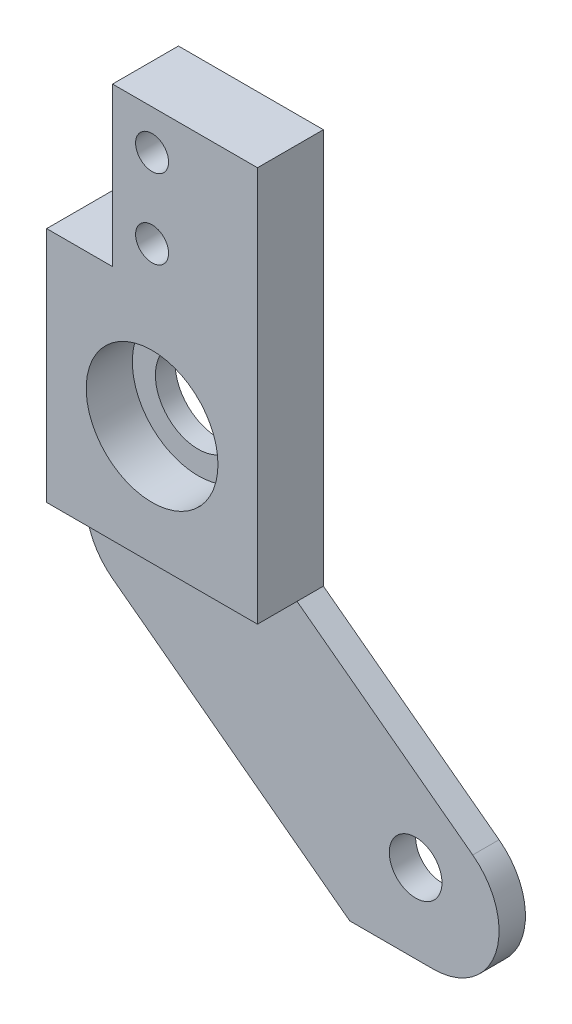
ISO-10303-21;
HEADER;
FILE_DESCRIPTION(('STEP AP214'),'2;1');
FILE_NAME('part.step','',(''),(''),'','','');
FILE_SCHEMA(('AUTOMOTIVE_DESIGN { 1 0 10303 214 1 1 1 1 }'));
ENDSEC;
DATA;
#1=APPLICATION_CONTEXT('core data for automotive mechanical design processes');
#2=APPLICATION_PROTOCOL_DEFINITION('international standard','automotive_design',2000,#1);
#3=PRODUCT_CONTEXT('',#1,'mechanical');
#4=PRODUCT('Part','Part','',(#3));
#5=PRODUCT_RELATED_PRODUCT_CATEGORY('part','',(#4));
#6=PRODUCT_DEFINITION_FORMATION('','',#4);
#7=PRODUCT_DEFINITION_CONTEXT('part definition',#1,'design');
#8=PRODUCT_DEFINITION('design','',#6,#7);
#9=PRODUCT_DEFINITION_SHAPE('','',#8);
#10=(LENGTH_UNIT() NAMED_UNIT(*) SI_UNIT(.MILLI.,.METRE.));
#11=(NAMED_UNIT(*) PLANE_ANGLE_UNIT() SI_UNIT($,.RADIAN.));
#12=(NAMED_UNIT(*) SI_UNIT($,.STERADIAN.) SOLID_ANGLE_UNIT());
#13=UNCERTAINTY_MEASURE_WITH_UNIT(LENGTH_MEASURE(1.E-05),#10,'distance_accuracy_value','');
#14=(GEOMETRIC_REPRESENTATION_CONTEXT(3) GLOBAL_UNCERTAINTY_ASSIGNED_CONTEXT((#13)) GLOBAL_UNIT_ASSIGNED_CONTEXT((#10,
#11,#12)) REPRESENTATION_CONTEXT('',''));
#15=CARTESIAN_POINT('',(0.,0.,0.));
#16=DIRECTION('',(0.,0.,1.));
#17=DIRECTION('',(1.,0.,0.));
#18=AXIS2_PLACEMENT_3D('',#15,#16,#17);
#19=CARTESIAN_POINT('',(4.49443926390629,-28.,5.));
#20=DIRECTION('',(0.,-1.,0.));
#21=DIRECTION('',(0.,0.,-1.));
#22=AXIS2_PLACEMENT_3D('',#19,#20,#21);
#23=PLANE('',#22);
#24=DIRECTION('',(1.,0.,0.));
#25=VECTOR('',#24,1.);
#26=CARTESIAN_POINT('',(12.,-28.,2.));
#27=LINE('',#26,#25);
#28=CARTESIAN_POINT('',(12.,-28.,2.));
#29=VERTEX_POINT('',#28);
#30=CARTESIAN_POINT('',(18.3333333333333,-28.,2.));
#31=VERTEX_POINT('',#30);
#32=EDGE_CURVE('E50',#29,#31,#27,.T.);
#33=ORIENTED_EDGE('',*,*,#32,.F.);
#34=DIRECTION('',(0.,0.,-1.));
#35=VECTOR('',#34,1.);
#36=CARTESIAN_POINT('',(12.,-28.,5.));
#37=LINE('',#36,#35);
#38=CARTESIAN_POINT('',(12.,-28.,0.));
#39=VERTEX_POINT('',#38);
#40=EDGE_CURVE('E139',#29,#39,#37,.T.);
#41=ORIENTED_EDGE('',*,*,#40,.T.);
#42=DIRECTION('',(-1.,0.,0.));
#43=VECTOR('',#42,1.);
#44=CARTESIAN_POINT('',(4.49443926390629,-28.,0.));
#45=LINE('',#44,#43);
#46=CARTESIAN_POINT('',(18.3333333333333,-28.,0.));
#47=VERTEX_POINT('',#46);
#48=EDGE_CURVE('E173',#47,#39,#45,.T.);
#49=ORIENTED_EDGE('',*,*,#48,.F.);
#50=DIRECTION('',(0.,0.,-1.));
#51=VECTOR('',#50,1.);
#52=CARTESIAN_POINT('',(18.3333333333333,-28.,5.));
#53=LINE('',#52,#51);
#54=EDGE_CURVE('E11',#47,#31,#53,.F.);
#55=ORIENTED_EDGE('',*,*,#54,.T.);
#56=EDGE_LOOP('',(#33,#41,#49,#55));
#57=FACE_BOUND('',#56,.T.);
#58=ADVANCED_FACE('F34',(#57),#23,.T.);
#59=CARTESIAN_POINT('',(33.4778201720869,-28.1083651290652,5.));
#60=DIRECTION('',(0.6,0.8,0.));
#61=DIRECTION('',(-0.8,0.6,0.));
#62=AXIS2_PLACEMENT_3D('',#59,#60,#61);
#63=PLANE('',#62);
#64=DIRECTION('',(-0.8,0.6,0.));
#65=VECTOR('',#64,1.);
#66=CARTESIAN_POINT('',(21.3333333333333,-19.,2.));
#67=LINE('',#66,#65);
#68=CARTESIAN_POINT('',(21.3333333333333,-19.,2.));
#69=VERTEX_POINT('',#68);
#70=CARTESIAN_POINT('',(8.00000000000001,-9.,2.));
#71=VERTEX_POINT('',#70);
#72=EDGE_CURVE('E165',#69,#71,#67,.T.);
#73=ORIENTED_EDGE('',*,*,#72,.F.);
#74=DIRECTION('',(0.,0.,-1.));
#75=VECTOR('',#74,1.);
#76=CARTESIAN_POINT('',(21.3333333333333,-19.,5.));
#77=LINE('',#76,#75);
#78=CARTESIAN_POINT('',(21.3333333333333,-19.,0.));
#79=VERTEX_POINT('',#78);
#80=EDGE_CURVE('E43',#69,#79,#77,.T.);
#81=ORIENTED_EDGE('',*,*,#80,.T.);
#82=DIRECTION('',(0.8,-0.6,0.));
#83=VECTOR('',#82,1.);
#84=CARTESIAN_POINT('',(33.4778201720869,-28.1083651290652,0.));
#85=LINE('',#84,#83);
#86=CARTESIAN_POINT('',(8.00000000000001,-9.00000000000001,0.));
#87=VERTEX_POINT('',#86);
#88=EDGE_CURVE('E162',#87,#79,#85,.T.);
#89=ORIENTED_EDGE('',*,*,#88,.F.);
#90=DIRECTION('',(0.,0.,-1.));
#91=VECTOR('',#90,1.);
#92=CARTESIAN_POINT('',(8.00000000000001,-9.00000000000001,5.));
#93=LINE('',#92,#91);
#94=EDGE_CURVE('E147',#71,#87,#93,.T.);
#95=ORIENTED_EDGE('',*,*,#94,.F.);
#96=EDGE_LOOP('',(#73,#81,#89,#95));
#97=FACE_BOUND('',#96,.T.);
#98=ADVANCED_FACE('F159',(#97),#63,.T.);
#99=CARTESIAN_POINT('',(8.00000000000001,-66.7528730066393,5.));
#100=DIRECTION('',(1.,0.,0.));
#101=DIRECTION('',(0.,1.,0.));
#102=AXIS2_PLACEMENT_3D('',#99,#100,#101);
#103=PLANE('',#102);
#104=DIRECTION('',(0.,-1.,0.));
#105=VECTOR('',#104,1.);
#106=CARTESIAN_POINT('',(8.00000000000001,-66.7528730066393,0.));
#107=LINE('',#106,#105);
#108=CARTESIAN_POINT('',(8.,21.,0.));
#109=VERTEX_POINT('',#108);
#110=EDGE_CURVE('E172',#109,#87,#107,.T.);
#111=ORIENTED_EDGE('',*,*,#110,.F.);
#112=DIRECTION('',(0.,0.,-1.));
#113=VECTOR('',#112,1.);
#114=CARTESIAN_POINT('',(8.,21.,5.));
#115=LINE('',#114,#113);
#116=CARTESIAN_POINT('',(8.,21.,5.));
#117=VERTEX_POINT('',#116);
#118=EDGE_CURVE('E187',#117,#109,#115,.T.);
#119=ORIENTED_EDGE('',*,*,#118,.F.);
#120=DIRECTION('',(0.,-1.,0.));
#121=VECTOR('',#120,1.);
#122=CARTESIAN_POINT('',(8.00000000000001,-66.7528730066393,5.));
#123=LINE('',#122,#121);
#124=CARTESIAN_POINT('',(8.00000000000001,-9.,5.));
#125=VERTEX_POINT('',#124);
#126=EDGE_CURVE('E186',#117,#125,#123,.T.);
#127=ORIENTED_EDGE('',*,*,#126,.T.);
#128=EDGE_CURVE('E143',#125,#71,#93,.T.);
#129=ORIENTED_EDGE('',*,*,#128,.T.);
#130=ORIENTED_EDGE('',*,*,#94,.T.);
#131=EDGE_LOOP('',(#111,#119,#127,#129,#130));
#132=FACE_BOUND('',#131,.T.);
#133=ADVANCED_FACE('F194',(#132),#103,.T.);
#134=CARTESIAN_POINT('',(4.49443926390629,21.,5.));
#135=DIRECTION('',(0.,1.,0.));
#136=DIRECTION('',(0.,0.,1.));
#137=AXIS2_PLACEMENT_3D('',#134,#135,#136);
#138=PLANE('',#137);
#139=DIRECTION('',(0.,0.,1.));
#140=VECTOR('',#139,1.);
#141=CARTESIAN_POINT('',(-3.,21.,-13.));
#142=LINE('',#141,#140);
#143=CARTESIAN_POINT('',(-3.,21.,0.));
#144=VERTEX_POINT('',#143);
#145=CARTESIAN_POINT('',(-3.,21.,5.));
#146=VERTEX_POINT('',#145);
#147=EDGE_CURVE('E234',#144,#146,#142,.T.);
#148=ORIENTED_EDGE('',*,*,#147,.T.);
#149=DIRECTION('',(1.,0.,0.));
#150=VECTOR('',#149,1.);
#151=CARTESIAN_POINT('',(4.49443926390629,21.,5.));
#152=LINE('',#151,#150);
#153=EDGE_CURVE('E260',#146,#117,#152,.T.);
#154=ORIENTED_EDGE('',*,*,#153,.T.);
#155=ORIENTED_EDGE('',*,*,#118,.T.);
#156=DIRECTION('',(1.,0.,0.));
#157=VECTOR('',#156,1.);
#158=CARTESIAN_POINT('',(4.49443926390629,21.,0.));
#159=LINE('',#158,#157);
#160=EDGE_CURVE('E175',#144,#109,#159,.T.);
#161=ORIENTED_EDGE('',*,*,#160,.F.);
#162=EDGE_LOOP('',(#148,#154,#155,#161));
#163=FACE_BOUND('',#162,.T.);
#164=ADVANCED_FACE('F271',(#163),#138,.T.);
#165=CARTESIAN_POINT('',(-8.,-66.7528730066393,5.));
#166=DIRECTION('',(-1.,0.,0.));
#167=DIRECTION('',(0.,0.,1.));
#168=AXIS2_PLACEMENT_3D('',#165,#166,#167);
#169=PLANE('',#168);
#170=DIRECTION('',(0.,0.,1.));
#171=VECTOR('',#170,1.);
#172=CARTESIAN_POINT('',(-8.,-9.,2.));
#173=LINE('',#172,#171);
#174=CARTESIAN_POINT('',(-8.,-9.,2.));
#175=VERTEX_POINT('',#174);
#176=CARTESIAN_POINT('',(-8.,-9.,5.));
#177=VERTEX_POINT('',#176);
#178=EDGE_CURVE('E212',#175,#177,#173,.T.);
#179=ORIENTED_EDGE('',*,*,#178,.T.);
#180=DIRECTION('',(0.,1.,0.));
#181=VECTOR('',#180,1.);
#182=CARTESIAN_POINT('',(-8.,-66.7528730066393,5.));
#183=LINE('',#182,#181);
#184=CARTESIAN_POINT('',(-8.,9.00000000000001,5.));
#185=VERTEX_POINT('',#184);
#186=EDGE_CURVE('E188',#177,#185,#183,.T.);
#187=ORIENTED_EDGE('',*,*,#186,.T.);
#188=DIRECTION('',(0.,0.,1.));
#189=VECTOR('',#188,1.);
#190=CARTESIAN_POINT('',(-8.,9.00000000000001,-13.));
#191=LINE('',#190,#189);
#192=CARTESIAN_POINT('',(-8.,9.00000000000001,0.));
#193=VERTEX_POINT('',#192);
#194=EDGE_CURVE('E239',#193,#185,#191,.T.);
#195=ORIENTED_EDGE('',*,*,#194,.F.);
#196=DIRECTION('',(0.,1.,0.));
#197=VECTOR('',#196,1.);
#198=CARTESIAN_POINT('',(-8.,-66.7528730066393,0.));
#199=LINE('',#198,#197);
#200=CARTESIAN_POINT('',(-8.,-10.5,0.));
#201=VERTEX_POINT('',#200);
#202=EDGE_CURVE('E182',#201,#193,#199,.T.);
#203=ORIENTED_EDGE('',*,*,#202,.F.);
#204=DIRECTION('',(0.,0.,-1.));
#205=VECTOR('',#204,1.);
#206=CARTESIAN_POINT('',(-8.,-10.5,5.));
#207=LINE('',#206,#205);
#208=CARTESIAN_POINT('',(-8.,-10.5,2.));
#209=VERTEX_POINT('',#208);
#210=EDGE_CURVE('E152',#201,#209,#207,.F.);
#211=ORIENTED_EDGE('',*,*,#210,.T.);
#212=DIRECTION('',(0.,-1.,0.));
#213=VECTOR('',#212,1.);
#214=CARTESIAN_POINT('',(-8.,-9.,2.));
#215=LINE('',#214,#213);
#216=EDGE_CURVE('E127',#175,#209,#215,.T.);
#217=ORIENTED_EDGE('',*,*,#216,.F.);
#218=EDGE_LOOP('',(#179,#187,#195,#203,#211,#217));
#219=FACE_BOUND('',#218,.T.);
#220=ADVANCED_FACE('F263',(#219),#169,.T.);
#221=CARTESIAN_POINT('',(25.7978201720869,-38.3483651290652,5.));
#222=DIRECTION('',(0.6,0.8,0.));
#223=DIRECTION('',(-0.8,0.6,0.));
#224=AXIS2_PLACEMENT_3D('',#221,#222,#223);
#225=PLANE('',#224);
#226=ORIENTED_EDGE('',*,*,#40,.F.);
#227=DIRECTION('',(0.8,-0.6,0.));
#228=VECTOR('',#227,1.);
#229=CARTESIAN_POINT('',(12.,-28.,2.));
#230=LINE('',#229,#228);
#231=CARTESIAN_POINT('',(-6.,-14.5,2.));
#232=VERTEX_POINT('',#231);
#233=EDGE_CURVE('E124',#232,#29,#230,.T.);
#234=ORIENTED_EDGE('',*,*,#233,.F.);
#235=DIRECTION('',(0.,0.,-1.));
#236=VECTOR('',#235,1.);
#237=CARTESIAN_POINT('',(-6.00000000000001,-14.5,0.));
#238=LINE('',#237,#236);
#239=CARTESIAN_POINT('',(-6.,-14.5,0.));
#240=VERTEX_POINT('',#239);
#241=EDGE_CURVE('E138',#232,#240,#238,.T.);
#242=ORIENTED_EDGE('',*,*,#241,.T.);
#243=DIRECTION('',(0.8,-0.6,0.));
#244=VECTOR('',#243,1.);
#245=CARTESIAN_POINT('',(25.7978201720869,-38.3483651290652,0.));
#246=LINE('',#245,#244);
#247=EDGE_CURVE('E184',#240,#39,#246,.T.);
#248=ORIENTED_EDGE('',*,*,#247,.T.);
#249=EDGE_LOOP('',(#226,#234,#242,#248));
#250=FACE_BOUND('',#249,.T.);
#251=ADVANCED_FACE('F136',(#250),#225,.F.);
#252=CARTESIAN_POINT('',(4.49443926390629,-66.7528730066393,5.));
#253=DIRECTION('',(0.,0.,1.));
#254=DIRECTION('',(1.,0.,0.));
#255=AXIS2_PLACEMENT_3D('',#252,#253,#254);
#256=PLANE('',#255);
#257=DIRECTION('',(-1.,0.,0.));
#258=VECTOR('',#257,1.);
#259=CARTESIAN_POINT('',(8.00000000000001,-9.,5.));
#260=LINE('',#259,#258);
#261=EDGE_CURVE('E132',#125,#177,#260,.T.);
#262=ORIENTED_EDGE('',*,*,#261,.F.);
#263=ORIENTED_EDGE('',*,*,#126,.F.);
#264=ORIENTED_EDGE('',*,*,#153,.F.);
#265=DIRECTION('',(0.,1.,0.));
#266=VECTOR('',#265,1.);
#267=CARTESIAN_POINT('',(-3.,21.,5.));
#268=LINE('',#267,#266);
#269=CARTESIAN_POINT('',(-3.,9.00000000000001,5.));
#270=VERTEX_POINT('',#269);
#271=EDGE_CURVE('E237',#270,#146,#268,.T.);
#272=ORIENTED_EDGE('',*,*,#271,.F.);
#273=DIRECTION('',(1.,0.,0.));
#274=VECTOR('',#273,1.);
#275=CARTESIAN_POINT('',(-8.,9.00000000000001,5.));
#276=LINE('',#275,#274);
#277=EDGE_CURVE('E229',#185,#270,#276,.T.);
#278=ORIENTED_EDGE('',*,*,#277,.F.);
#279=ORIENTED_EDGE('',*,*,#186,.F.);
#280=EDGE_LOOP('',(#262,#263,#264,#272,#278,#279));
#281=FACE_BOUND('',#280,.T.);
#282=CARTESIAN_POINT('',(0.,12.,5.));
#283=DIRECTION('',(0.,0.,1.));
#284=DIRECTION('',(1.,0.,0.));
#285=AXIS2_PLACEMENT_3D('',#282,#283,#284);
#286=CIRCLE('',#285,1.25);
#287=CARTESIAN_POINT('',(-1.25,12.,5.));
#288=VERTEX_POINT('',#287);
#289=EDGE_CURVE('E220',#288,#288,#286,.F.);
#290=ORIENTED_EDGE('',*,*,#289,.T.);
#291=EDGE_LOOP('',(#290));
#292=FACE_BOUND('',#291,.T.);
#293=CARTESIAN_POINT('',(0.,18.,5.));
#294=DIRECTION('',(0.,0.,1.));
#295=DIRECTION('',(1.,0.,0.));
#296=AXIS2_PLACEMENT_3D('',#293,#294,#295);
#297=CIRCLE('',#296,1.25);
#298=CARTESIAN_POINT('',(-1.25,18.,5.));
#299=VERTEX_POINT('',#298);
#300=EDGE_CURVE('E226',#299,#299,#297,.F.);
#301=ORIENTED_EDGE('',*,*,#300,.T.);
#302=EDGE_LOOP('',(#301));
#303=FACE_BOUND('',#302,.T.);
#304=CARTESIAN_POINT('',(0.,0.,5.));
#305=DIRECTION('',(0.,0.,1.));
#306=DIRECTION('',(1.,0.,0.));
#307=AXIS2_PLACEMENT_3D('',#304,#305,#306);
#308=CIRCLE('',#307,5.);
#309=CARTESIAN_POINT('',(5.,0.,5.));
#310=VERTEX_POINT('',#309);
#311=EDGE_CURVE('E254',#310,#310,#308,.T.);
#312=ORIENTED_EDGE('',*,*,#311,.F.);
#313=EDGE_LOOP('',(#312));
#314=FACE_BOUND('',#313,.T.);
#315=ADVANCED_FACE('F204',(#281,#292,#303,#314),#256,.T.);
#316=CARTESIAN_POINT('',(4.49443926390629,-66.7528730066393,0.));
#317=DIRECTION('',(0.,0.,1.));
#318=DIRECTION('',(1.,0.,0.));
#319=AXIS2_PLACEMENT_3D('',#316,#317,#318);
#320=PLANE('',#319);
#321=CARTESIAN_POINT('',(17.,-22.,0.));
#322=DIRECTION('',(0.,0.,1.));
#323=DIRECTION('',(1.,0.,0.));
#324=AXIS2_PLACEMENT_3D('',#321,#322,#323);
#325=CIRCLE('',#324,2.);
#326=CARTESIAN_POINT('',(19.,-22.,0.));
#327=VERTEX_POINT('',#326);
#328=EDGE_CURVE('E214',#327,#327,#325,.F.);
#329=ORIENTED_EDGE('',*,*,#328,.F.);
#330=EDGE_LOOP('',(#329));
#331=FACE_BOUND('',#330,.T.);
#332=CARTESIAN_POINT('',(0.,12.,0.));
#333=DIRECTION('',(0.,0.,-1.));
#334=DIRECTION('',(-1.,0.,0.));
#335=AXIS2_PLACEMENT_3D('',#332,#333,#334);
#336=CIRCLE('',#335,1.25);
#337=CARTESIAN_POINT('',(-1.25,12.,0.));
#338=VERTEX_POINT('',#337);
#339=EDGE_CURVE('E217',#338,#338,#336,.T.);
#340=ORIENTED_EDGE('',*,*,#339,.F.);
#341=EDGE_LOOP('',(#340));
#342=FACE_BOUND('',#341,.T.);
#343=CARTESIAN_POINT('',(0.,18.,0.));
#344=DIRECTION('',(0.,0.,-1.));
#345=DIRECTION('',(-1.,0.,0.));
#346=AXIS2_PLACEMENT_3D('',#343,#344,#345);
#347=CIRCLE('',#346,1.25);
#348=CARTESIAN_POINT('',(-1.25,18.,0.));
#349=VERTEX_POINT('',#348);
#350=EDGE_CURVE('E223',#349,#349,#347,.T.);
#351=ORIENTED_EDGE('',*,*,#350,.F.);
#352=EDGE_LOOP('',(#351));
#353=FACE_BOUND('',#352,.T.);
#354=CARTESIAN_POINT('',(0.,0.,0.));
#355=DIRECTION('',(0.,0.,1.));
#356=DIRECTION('',(1.,0.,0.));
#357=AXIS2_PLACEMENT_3D('',#354,#355,#356);
#358=CIRCLE('',#357,3.25);
#359=CARTESIAN_POINT('',(3.25,0.,0.));
#360=VERTEX_POINT('',#359);
#361=EDGE_CURVE('E251',#360,#360,#358,.F.);
#362=ORIENTED_EDGE('',*,*,#361,.F.);
#363=EDGE_LOOP('',(#362));
#364=FACE_BOUND('',#363,.T.);
#365=ORIENTED_EDGE('',*,*,#247,.F.);
#366=CARTESIAN_POINT('',(-3.,-10.5,0.));
#367=DIRECTION('',(0.,0.,1.));
#368=DIRECTION('',(1.,0.,0.));
#369=AXIS2_PLACEMENT_3D('',#366,#367,#368);
#370=CIRCLE('',#369,5.);
#371=EDGE_CURVE('E58',#240,#201,#370,.F.);
#372=ORIENTED_EDGE('',*,*,#371,.T.);
#373=ORIENTED_EDGE('',*,*,#202,.T.);
#374=DIRECTION('',(-1.,0.,0.));
#375=VECTOR('',#374,1.);
#376=CARTESIAN_POINT('',(-8.,9.00000000000001,0.));
#377=LINE('',#376,#375);
#378=CARTESIAN_POINT('',(-3.,9.00000000000001,0.));
#379=VERTEX_POINT('',#378);
#380=EDGE_CURVE('E233',#379,#193,#377,.T.);
#381=ORIENTED_EDGE('',*,*,#380,.F.);
#382=DIRECTION('',(0.,-1.,0.));
#383=VECTOR('',#382,1.);
#384=CARTESIAN_POINT('',(-3.,21.,0.));
#385=LINE('',#384,#383);
#386=EDGE_CURVE('E230',#144,#379,#385,.T.);
#387=ORIENTED_EDGE('',*,*,#386,.F.);
#388=ORIENTED_EDGE('',*,*,#160,.T.);
#389=ORIENTED_EDGE('',*,*,#110,.T.);
#390=ORIENTED_EDGE('',*,*,#88,.T.);
#391=CARTESIAN_POINT('',(18.3333333333333,-23.,0.));
#392=DIRECTION('',(0.,0.,1.));
#393=DIRECTION('',(1.,0.,0.));
#394=AXIS2_PLACEMENT_3D('',#391,#392,#393);
#395=CIRCLE('',#394,5.);
#396=EDGE_CURVE('E142',#79,#47,#395,.F.);
#397=ORIENTED_EDGE('',*,*,#396,.T.);
#398=ORIENTED_EDGE('',*,*,#48,.T.);
#399=EDGE_LOOP('',(#365,#372,#373,#381,#387,#388,#389,#390,#397,#398));
#400=FACE_BOUND('',#399,.T.);
#401=ADVANCED_FACE('F170',(#331,#342,#353,#364,#400),#320,.F.);
#402=CARTESIAN_POINT('',(0.,0.,1.5));
#403=DIRECTION('',(0.,0.,1.));
#404=DIRECTION('',(1.,0.,0.));
#405=AXIS2_PLACEMENT_3D('',#402,#403,#404);
#406=CYLINDRICAL_SURFACE('',#405,5.);
#407=CARTESIAN_POINT('',(0.,0.,1.5));
#408=DIRECTION('',(0.,0.,1.));
#409=DIRECTION('',(1.,0.,0.));
#410=AXIS2_PLACEMENT_3D('',#407,#408,#409);
#411=CIRCLE('',#410,5.);
#412=CARTESIAN_POINT('',(5.,0.,1.5));
#413=VERTEX_POINT('',#412);
#414=EDGE_CURVE('E177',#413,#413,#411,.T.);
#415=ORIENTED_EDGE('',*,*,#414,.F.);
#416=EDGE_LOOP('',(#415));
#417=FACE_BOUND('',#416,.T.);
#418=ORIENTED_EDGE('',*,*,#311,.T.);
#419=EDGE_LOOP('',(#418));
#420=FACE_BOUND('',#419,.T.);
#421=ADVANCED_FACE('F314',(#417,#420),#406,.F.);
#422=CARTESIAN_POINT('',(0.,0.,1.5));
#423=DIRECTION('',(0.,0.,1.));
#424=DIRECTION('',(1.,0.,0.));
#425=AXIS2_PLACEMENT_3D('',#422,#423,#424);
#426=PLANE('',#425);
#427=CARTESIAN_POINT('',(0.,0.,1.5));
#428=DIRECTION('',(0.,0.,1.));
#429=DIRECTION('',(1.,0.,0.));
#430=AXIS2_PLACEMENT_3D('',#427,#428,#429);
#431=CIRCLE('',#430,3.25);
#432=CARTESIAN_POINT('',(3.25,0.,1.5));
#433=VERTEX_POINT('',#432);
#434=EDGE_CURVE('E248',#433,#433,#431,.T.);
#435=ORIENTED_EDGE('',*,*,#434,.F.);
#436=EDGE_LOOP('',(#435));
#437=FACE_BOUND('',#436,.T.);
#438=ORIENTED_EDGE('',*,*,#414,.T.);
#439=EDGE_LOOP('',(#438));
#440=FACE_BOUND('',#439,.T.);
#441=ADVANCED_FACE('F310',(#437,#440),#426,.T.);
#442=CARTESIAN_POINT('',(0.,0.,-9.19238815542512));
#443=DIRECTION('',(0.,0.,1.));
#444=DIRECTION('',(1.,0.,0.));
#445=AXIS2_PLACEMENT_3D('',#442,#443,#444);
#446=CYLINDRICAL_SURFACE('',#445,3.25);
#447=ORIENTED_EDGE('',*,*,#361,.T.);
#448=EDGE_LOOP('',(#447));
#449=FACE_BOUND('',#448,.T.);
#450=ORIENTED_EDGE('',*,*,#434,.T.);
#451=EDGE_LOOP('',(#450));
#452=FACE_BOUND('',#451,.T.);
#453=ADVANCED_FACE('F305',(#449,#452),#446,.F.);
#454=CARTESIAN_POINT('',(-3.,21.,-13.));
#455=DIRECTION('',(1.,0.,0.));
#456=DIRECTION('',(0.,1.,0.));
#457=AXIS2_PLACEMENT_3D('',#454,#455,#456);
#458=PLANE('',#457);
#459=ORIENTED_EDGE('',*,*,#386,.T.);
#460=DIRECTION('',(0.,0.,1.));
#461=VECTOR('',#460,1.);
#462=CARTESIAN_POINT('',(-3.,9.00000000000001,-13.));
#463=LINE('',#462,#461);
#464=EDGE_CURVE('E242',#379,#270,#463,.T.);
#465=ORIENTED_EDGE('',*,*,#464,.T.);
#466=ORIENTED_EDGE('',*,*,#271,.T.);
#467=ORIENTED_EDGE('',*,*,#147,.F.);
#468=EDGE_LOOP('',(#459,#465,#466,#467));
#469=FACE_BOUND('',#468,.T.);
#470=ADVANCED_FACE('F269',(#469),#458,.F.);
#471=CARTESIAN_POINT('',(-8.,9.00000000000001,-13.));
#472=DIRECTION('',(0.,-1.,0.));
#473=DIRECTION('',(0.,0.,-1.));
#474=AXIS2_PLACEMENT_3D('',#471,#472,#473);
#475=PLANE('',#474);
#476=ORIENTED_EDGE('',*,*,#380,.T.);
#477=ORIENTED_EDGE('',*,*,#194,.T.);
#478=ORIENTED_EDGE('',*,*,#277,.T.);
#479=ORIENTED_EDGE('',*,*,#464,.F.);
#480=EDGE_LOOP('',(#476,#477,#478,#479));
#481=FACE_BOUND('',#480,.T.);
#482=ADVANCED_FACE('F265',(#481),#475,.F.);
#483=CARTESIAN_POINT('',(0.,18.,8.53553390593274));
#484=DIRECTION('',(0.,0.,-1.));
#485=DIRECTION('',(-1.,0.,0.));
#486=AXIS2_PLACEMENT_3D('',#483,#484,#485);
#487=CYLINDRICAL_SURFACE('',#486,1.25);
#488=CARTESIAN_POINT('',(-1.25,18.,0.));
#489=CARTESIAN_POINT('',(-1.25,18.,0.0520833333333351));
#490=CARTESIAN_POINT('',(-1.25,18.,0.104166666666669));
#491=CARTESIAN_POINT('',(-1.25,18.,0.208333333333335));
#492=CARTESIAN_POINT('',(-1.25,18.,0.260416666666669));
#493=CARTESIAN_POINT('',(-1.25,18.,0.364583333333335));
#494=CARTESIAN_POINT('',(-1.25,18.,0.416666666666669));
#495=CARTESIAN_POINT('',(-1.25,18.,0.520833333333335));
#496=CARTESIAN_POINT('',(-1.25,18.,0.572916666666669));
#497=CARTESIAN_POINT('',(-1.25,18.,0.677083333333335));
#498=CARTESIAN_POINT('',(-1.25,18.,0.729166666666668));
#499=CARTESIAN_POINT('',(-1.25,18.,0.833333333333334));
#500=CARTESIAN_POINT('',(-1.25,18.,0.885416666666668));
#501=CARTESIAN_POINT('',(-1.25,18.,0.989583333333334));
#502=CARTESIAN_POINT('',(-1.25,18.,1.04166666666667));
#503=CARTESIAN_POINT('',(-1.25,18.,1.14583333333333));
#504=CARTESIAN_POINT('',(-1.25,18.,1.19791666666667));
#505=CARTESIAN_POINT('',(-1.25,18.,1.30208333333333));
#506=CARTESIAN_POINT('',(-1.25,18.,1.35416666666667));
#507=CARTESIAN_POINT('',(-1.25,18.,1.45833333333333));
#508=CARTESIAN_POINT('',(-1.25,18.,1.51041666666667));
#509=CARTESIAN_POINT('',(-1.25,18.,1.61458333333333));
#510=CARTESIAN_POINT('',(-1.25,18.,1.66666666666667));
#511=CARTESIAN_POINT('',(-1.25,18.,1.77083333333333));
#512=CARTESIAN_POINT('',(-1.25,18.,1.82291666666667));
#513=CARTESIAN_POINT('',(-1.25,18.,1.92708333333333));
#514=CARTESIAN_POINT('',(-1.25,18.,1.97916666666667));
#515=CARTESIAN_POINT('',(-1.25,18.,2.08333333333333));
#516=CARTESIAN_POINT('',(-1.25,18.,2.13541666666667));
#517=CARTESIAN_POINT('',(-1.25,18.,2.23958333333333));
#518=CARTESIAN_POINT('',(-1.25,18.,2.29166666666667));
#519=CARTESIAN_POINT('',(-1.25,18.,2.39583333333333));
#520=CARTESIAN_POINT('',(-1.25,18.,2.44791666666667));
#521=CARTESIAN_POINT('',(-1.25,18.,2.55208333333333));
#522=CARTESIAN_POINT('',(-1.25,18.,2.60416666666667));
#523=CARTESIAN_POINT('',(-1.25,18.,2.70833333333333));
#524=CARTESIAN_POINT('',(-1.25,18.,2.76041666666667));
#525=CARTESIAN_POINT('',(-1.25,18.,2.86458333333333));
#526=CARTESIAN_POINT('',(-1.25,18.,2.91666666666667));
#527=CARTESIAN_POINT('',(-1.25,18.,3.02083333333333));
#528=CARTESIAN_POINT('',(-1.25,18.,3.07291666666667));
#529=CARTESIAN_POINT('',(-1.25,18.,3.17708333333333));
#530=CARTESIAN_POINT('',(-1.25,18.,3.22916666666667));
#531=CARTESIAN_POINT('',(-1.25,18.,3.33333333333333));
#532=CARTESIAN_POINT('',(-1.25,18.,3.38541666666667));
#533=CARTESIAN_POINT('',(-1.25,18.,3.48958333333333));
#534=CARTESIAN_POINT('',(-1.25,18.,3.54166666666667));
#535=CARTESIAN_POINT('',(-1.25,18.,3.64583333333333));
#536=CARTESIAN_POINT('',(-1.25,18.,3.69791666666667));
#537=CARTESIAN_POINT('',(-1.25,18.,3.80208333333333));
#538=CARTESIAN_POINT('',(-1.25,18.,3.85416666666667));
#539=CARTESIAN_POINT('',(-1.25,18.,3.95833333333333));
#540=CARTESIAN_POINT('',(-1.25,18.,4.01041666666667));
#541=CARTESIAN_POINT('',(-1.25,18.,4.11458333333333));
#542=CARTESIAN_POINT('',(-1.25,18.,4.16666666666667));
#543=CARTESIAN_POINT('',(-1.25,18.,4.27083333333333));
#544=CARTESIAN_POINT('',(-1.25,18.,4.32291666666667));
#545=CARTESIAN_POINT('',(-1.25,18.,4.42708333333333));
#546=CARTESIAN_POINT('',(-1.25,18.,4.47916666666667));
#547=CARTESIAN_POINT('',(-1.25,18.,4.58333333333333));
#548=CARTESIAN_POINT('',(-1.25,18.,4.63541666666667));
#549=CARTESIAN_POINT('',(-1.25,18.,4.73958333333333));
#550=CARTESIAN_POINT('',(-1.25,18.,4.79166666666667));
#551=CARTESIAN_POINT('',(-1.25,18.,4.89583333333333));
#552=CARTESIAN_POINT('',(-1.25,18.,4.94791666666667));
#553=CARTESIAN_POINT('',(-1.25,18.,5.));
#554=B_SPLINE_CURVE_WITH_KNOTS('',3,(#488,#489,#490,#491,#492,#493,#494,#495,#496,#497,#498,
#499,#500,#501,#502,#503,#504,#505,#506,#507,#508,#509,#510,#511,#512,#513,#514,#515,#516,#517,
#518,#519,#520,#521,#522,#523,#524,#525,#526,#527,#528,#529,#530,#531,#532,#533,#534,#535,#536,
#537,#538,#539,#540,#541,#542,#543,#544,#545,#546,#547,#548,#549,#550,#551,#552,#553),
.UNSPECIFIED.,.F.,.F.,(4,2,2,2,2,2,2,2,2,2,2,2,2,2,2,2,2,2,2,2,2,2,2,2,2,2,2,2,2,2,2,2,4),(0.,
0.15625,0.3125,0.46875,0.625000000000001,0.781249999999999,0.937499999999999,1.09375,1.25,
1.40625,1.5625,1.71875,1.875,2.03125,2.1875,2.34375,2.5,2.65625,2.8125,2.96875,3.125,3.28125,
3.4375,3.59375,3.75,3.90625,4.0625,4.21875,4.375,4.53125,4.6875,4.84375,5.),.UNSPECIFIED.);
#555=EDGE_CURVE('BSEAM291',#349,#299,#554,.T.);
#556=ORIENTED_EDGE('',*,*,#350,.T.);
#557=ORIENTED_EDGE('',*,*,#300,.F.);
#558=ORIENTED_EDGE('',*,*,#555,.T.);
#559=ORIENTED_EDGE('',*,*,#555,.F.);
#560=EDGE_LOOP('',(#556,#558,#557,#559));
#561=FACE_BOUND('',#560,.T.);
#562=ADVANCED_FACE('F291',(#561),#487,.F.);
#563=CARTESIAN_POINT('',(0.,12.,8.53553390593274));
#564=DIRECTION('',(0.,0.,-1.));
#565=DIRECTION('',(-1.,0.,0.));
#566=AXIS2_PLACEMENT_3D('',#563,#564,#565);
#567=CYLINDRICAL_SURFACE('',#566,1.25);
#568=CARTESIAN_POINT('',(-1.25,12.,0.));
#569=CARTESIAN_POINT('',(-1.25,12.,0.0520833333333351));
#570=CARTESIAN_POINT('',(-1.25,12.,0.104166666666669));
#571=CARTESIAN_POINT('',(-1.25,12.,0.208333333333335));
#572=CARTESIAN_POINT('',(-1.25,12.,0.260416666666669));
#573=CARTESIAN_POINT('',(-1.25,12.,0.364583333333335));
#574=CARTESIAN_POINT('',(-1.25,12.,0.416666666666669));
#575=CARTESIAN_POINT('',(-1.25,12.,0.520833333333335));
#576=CARTESIAN_POINT('',(-1.25,12.,0.572916666666669));
#577=CARTESIAN_POINT('',(-1.25,12.,0.677083333333335));
#578=CARTESIAN_POINT('',(-1.25,12.,0.729166666666668));
#579=CARTESIAN_POINT('',(-1.25,12.,0.833333333333334));
#580=CARTESIAN_POINT('',(-1.25,12.,0.885416666666668));
#581=CARTESIAN_POINT('',(-1.25,12.,0.989583333333334));
#582=CARTESIAN_POINT('',(-1.25,12.,1.04166666666667));
#583=CARTESIAN_POINT('',(-1.25,12.,1.14583333333333));
#584=CARTESIAN_POINT('',(-1.25,12.,1.19791666666667));
#585=CARTESIAN_POINT('',(-1.25,12.,1.30208333333333));
#586=CARTESIAN_POINT('',(-1.25,12.,1.35416666666667));
#587=CARTESIAN_POINT('',(-1.25,12.,1.45833333333333));
#588=CARTESIAN_POINT('',(-1.25,12.,1.51041666666667));
#589=CARTESIAN_POINT('',(-1.25,12.,1.61458333333333));
#590=CARTESIAN_POINT('',(-1.25,12.,1.66666666666667));
#591=CARTESIAN_POINT('',(-1.25,12.,1.77083333333333));
#592=CARTESIAN_POINT('',(-1.25,12.,1.82291666666667));
#593=CARTESIAN_POINT('',(-1.25,12.,1.92708333333333));
#594=CARTESIAN_POINT('',(-1.25,12.,1.97916666666667));
#595=CARTESIAN_POINT('',(-1.25,12.,2.08333333333333));
#596=CARTESIAN_POINT('',(-1.25,12.,2.13541666666667));
#597=CARTESIAN_POINT('',(-1.25,12.,2.23958333333333));
#598=CARTESIAN_POINT('',(-1.25,12.,2.29166666666667));
#599=CARTESIAN_POINT('',(-1.25,12.,2.39583333333333));
#600=CARTESIAN_POINT('',(-1.25,12.,2.44791666666667));
#601=CARTESIAN_POINT('',(-1.25,12.,2.55208333333333));
#602=CARTESIAN_POINT('',(-1.25,12.,2.60416666666667));
#603=CARTESIAN_POINT('',(-1.25,12.,2.70833333333333));
#604=CARTESIAN_POINT('',(-1.25,12.,2.76041666666667));
#605=CARTESIAN_POINT('',(-1.25,12.,2.86458333333333));
#606=CARTESIAN_POINT('',(-1.25,12.,2.91666666666667));
#607=CARTESIAN_POINT('',(-1.25,12.,3.02083333333333));
#608=CARTESIAN_POINT('',(-1.25,12.,3.07291666666667));
#609=CARTESIAN_POINT('',(-1.25,12.,3.17708333333333));
#610=CARTESIAN_POINT('',(-1.25,12.,3.22916666666667));
#611=CARTESIAN_POINT('',(-1.25,12.,3.33333333333333));
#612=CARTESIAN_POINT('',(-1.25,12.,3.38541666666667));
#613=CARTESIAN_POINT('',(-1.25,12.,3.48958333333333));
#614=CARTESIAN_POINT('',(-1.25,12.,3.54166666666667));
#615=CARTESIAN_POINT('',(-1.25,12.,3.64583333333333));
#616=CARTESIAN_POINT('',(-1.25,12.,3.69791666666667));
#617=CARTESIAN_POINT('',(-1.25,12.,3.80208333333333));
#618=CARTESIAN_POINT('',(-1.25,12.,3.85416666666667));
#619=CARTESIAN_POINT('',(-1.25,12.,3.95833333333333));
#620=CARTESIAN_POINT('',(-1.25,12.,4.01041666666667));
#621=CARTESIAN_POINT('',(-1.25,12.,4.11458333333333));
#622=CARTESIAN_POINT('',(-1.25,12.,4.16666666666667));
#623=CARTESIAN_POINT('',(-1.25,12.,4.27083333333333));
#624=CARTESIAN_POINT('',(-1.25,12.,4.32291666666667));
#625=CARTESIAN_POINT('',(-1.25,12.,4.42708333333333));
#626=CARTESIAN_POINT('',(-1.25,12.,4.47916666666667));
#627=CARTESIAN_POINT('',(-1.25,12.,4.58333333333333));
#628=CARTESIAN_POINT('',(-1.25,12.,4.63541666666667));
#629=CARTESIAN_POINT('',(-1.25,12.,4.73958333333333));
#630=CARTESIAN_POINT('',(-1.25,12.,4.79166666666667));
#631=CARTESIAN_POINT('',(-1.25,12.,4.89583333333333));
#632=CARTESIAN_POINT('',(-1.25,12.,4.94791666666667));
#633=CARTESIAN_POINT('',(-1.25,12.,5.));
#634=B_SPLINE_CURVE_WITH_KNOTS('',3,(#568,#569,#570,#571,#572,#573,#574,#575,#576,#577,#578,
#579,#580,#581,#582,#583,#584,#585,#586,#587,#588,#589,#590,#591,#592,#593,#594,#595,#596,#597,
#598,#599,#600,#601,#602,#603,#604,#605,#606,#607,#608,#609,#610,#611,#612,#613,#614,#615,#616,
#617,#618,#619,#620,#621,#622,#623,#624,#625,#626,#627,#628,#629,#630,#631,#632,#633),
.UNSPECIFIED.,.F.,.F.,(4,2,2,2,2,2,2,2,2,2,2,2,2,2,2,2,2,2,2,2,2,2,2,2,2,2,2,2,2,2,2,2,4),(0.,
0.15625,0.3125,0.46875,0.625000000000001,0.781249999999999,0.937499999999999,1.09375,1.25,
1.40625,1.5625,1.71875,1.875,2.03125,2.1875,2.34375,2.5,2.65625,2.8125,2.96875,3.125,3.28125,
3.4375,3.59375,3.75,3.90625,4.0625,4.21875,4.375,4.53125,4.6875,4.84375,5.),.UNSPECIFIED.);
#635=EDGE_CURVE('BSEAM285',#338,#288,#634,.T.);
#636=ORIENTED_EDGE('',*,*,#339,.T.);
#637=ORIENTED_EDGE('',*,*,#289,.F.);
#638=ORIENTED_EDGE('',*,*,#635,.T.);
#639=ORIENTED_EDGE('',*,*,#635,.F.);
#640=EDGE_LOOP('',(#636,#638,#637,#639));
#641=FACE_BOUND('',#640,.T.);
#642=ADVANCED_FACE('F285',(#641),#567,.F.);
#643=CARTESIAN_POINT('',(-3.,-10.5,5.));
#644=DIRECTION('',(0.,0.,1.));
#645=DIRECTION('',(1.,0.,0.));
#646=AXIS2_PLACEMENT_3D('',#643,#644,#645);
#647=CYLINDRICAL_SURFACE('',#646,5.);
#648=CARTESIAN_POINT('',(-3.00000000000001,-10.5,2.));
#649=DIRECTION('',(0.,0.,1.));
#650=DIRECTION('',(-1.,0.,0.));
#651=AXIS2_PLACEMENT_3D('',#648,#649,#650);
#652=CIRCLE('',#651,4.99999999999999);
#653=EDGE_CURVE('E120',#209,#232,#652,.T.);
#654=ORIENTED_EDGE('',*,*,#653,.F.);
#655=ORIENTED_EDGE('',*,*,#210,.F.);
#656=ORIENTED_EDGE('',*,*,#371,.F.);
#657=ORIENTED_EDGE('',*,*,#241,.F.);
#658=EDGE_LOOP('',(#654,#655,#656,#657));
#659=FACE_BOUND('',#658,.T.);
#660=ADVANCED_FACE('F141',(#659),#647,.T.);
#661=CARTESIAN_POINT('',(18.3333333333333,-23.,5.));
#662=DIRECTION('',(0.,0.,-1.));
#663=DIRECTION('',(-1.,0.,0.));
#664=AXIS2_PLACEMENT_3D('',#661,#662,#663);
#665=CYLINDRICAL_SURFACE('',#664,5.);
#666=CARTESIAN_POINT('',(18.3333333333333,-23.,2.));
#667=DIRECTION('',(0.,0.,1.));
#668=DIRECTION('',(1.,0.,0.));
#669=AXIS2_PLACEMENT_3D('',#666,#667,#668);
#670=CIRCLE('',#669,5.);
#671=EDGE_CURVE('E272',#31,#69,#670,.T.);
#672=ORIENTED_EDGE('',*,*,#671,.F.);
#673=ORIENTED_EDGE('',*,*,#54,.F.);
#674=ORIENTED_EDGE('',*,*,#396,.F.);
#675=ORIENTED_EDGE('',*,*,#80,.F.);
#676=EDGE_LOOP('',(#672,#673,#674,#675));
#677=FACE_BOUND('',#676,.T.);
#678=ADVANCED_FACE('F36',(#677),#665,.T.);
#679=CARTESIAN_POINT('',(17.,-22.,-5.65685424949236));
#680=DIRECTION('',(0.,0.,1.));
#681=DIRECTION('',(1.,0.,0.));
#682=AXIS2_PLACEMENT_3D('',#679,#680,#681);
#683=CYLINDRICAL_SURFACE('',#682,2.);
#684=CARTESIAN_POINT('',(17.,-22.,2.));
#685=DIRECTION('',(0.,0.,-1.));
#686=DIRECTION('',(-1.,0.,0.));
#687=AXIS2_PLACEMENT_3D('',#684,#685,#686);
#688=CIRCLE('',#687,2.);
#689=CARTESIAN_POINT('',(15.,-22.,2.));
#690=VERTEX_POINT('',#689);
#691=EDGE_CURVE('E38',#690,#690,#688,.F.);
#692=ORIENTED_EDGE('',*,*,#691,.T.);
#693=EDGE_LOOP('',(#692));
#694=FACE_BOUND('',#693,.T.);
#695=ORIENTED_EDGE('',*,*,#328,.T.);
#696=EDGE_LOOP('',(#695));
#697=FACE_BOUND('',#696,.T.);
#698=ADVANCED_FACE('F290',(#694,#697),#683,.F.);
#699=CARTESIAN_POINT('',(-3.00000000000001,-10.5,2.));
#700=DIRECTION('',(0.,0.,-1.));
#701=DIRECTION('',(-1.,0.,0.));
#702=AXIS2_PLACEMENT_3D('',#699,#700,#701);
#703=PLANE('',#702);
#704=ORIENTED_EDGE('',*,*,#653,.T.);
#705=ORIENTED_EDGE('',*,*,#233,.T.);
#706=ORIENTED_EDGE('',*,*,#32,.T.);
#707=ORIENTED_EDGE('',*,*,#671,.T.);
#708=ORIENTED_EDGE('',*,*,#72,.T.);
#709=DIRECTION('',(-1.,0.,0.));
#710=VECTOR('',#709,1.);
#711=CARTESIAN_POINT('',(8.00000000000001,-9.,2.));
#712=LINE('',#711,#710);
#713=EDGE_CURVE('E201',#71,#175,#712,.T.);
#714=ORIENTED_EDGE('',*,*,#713,.T.);
#715=ORIENTED_EDGE('',*,*,#216,.T.);
#716=EDGE_LOOP('',(#704,#705,#706,#707,#708,#714,#715));
#717=FACE_BOUND('',#716,.T.);
#718=ORIENTED_EDGE('',*,*,#691,.F.);
#719=EDGE_LOOP('',(#718));
#720=FACE_BOUND('',#719,.T.);
#721=ADVANCED_FACE('F122',(#717,#720),#703,.F.);
#722=CARTESIAN_POINT('',(8.00000000000001,-9.,2.));
#723=DIRECTION('',(0.,1.,0.));
#724=DIRECTION('',(0.,0.,1.));
#725=AXIS2_PLACEMENT_3D('',#722,#723,#724);
#726=PLANE('',#725);
#727=ORIENTED_EDGE('',*,*,#261,.T.);
#728=ORIENTED_EDGE('',*,*,#178,.F.);
#729=ORIENTED_EDGE('',*,*,#713,.F.);
#730=ORIENTED_EDGE('',*,*,#128,.F.);
#731=EDGE_LOOP('',(#727,#728,#729,#730));
#732=FACE_BOUND('',#731,.T.);
#733=ADVANCED_FACE('F199',(#732),#726,.F.);
#734=CLOSED_SHELL('',(#58,#98,#133,#164,#220,#251,#315,#401,#421,#441,#453,#470,#482,#562,#642,
#660,#678,#698,#721,#733));
#735=MANIFOLD_SOLID_BREP('B2',#734);
#736=ADVANCED_BREP_SHAPE_REPRESENTATION('',(#18,#735),#14);
#737=SHAPE_DEFINITION_REPRESENTATION(#9,#736);
ENDSEC;
END-ISO-10303-21;
